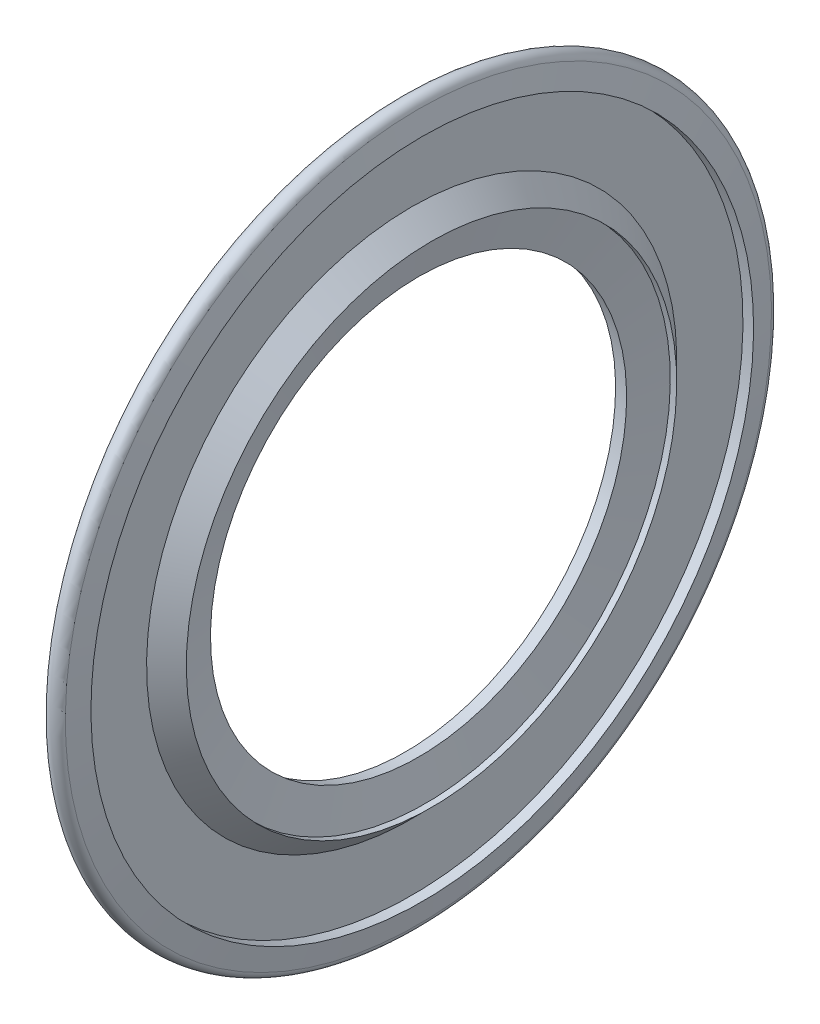
ISO-10303-21;
HEADER;
FILE_DESCRIPTION(('STEP AP214'),'2;1');
FILE_NAME('part.step','',(''),(''),'','','');
FILE_SCHEMA(('AUTOMOTIVE_DESIGN { 1 0 10303 214 1 1 1 1 }'));
ENDSEC;
DATA;
#1=APPLICATION_CONTEXT('core data for automotive mechanical design processes');
#2=APPLICATION_PROTOCOL_DEFINITION('international standard','automotive_design',2000,#1);
#3=PRODUCT_CONTEXT('',#1,'mechanical');
#4=PRODUCT('Part','Part','',(#3));
#5=PRODUCT_RELATED_PRODUCT_CATEGORY('part','',(#4));
#6=PRODUCT_DEFINITION_FORMATION('','',#4);
#7=PRODUCT_DEFINITION_CONTEXT('part definition',#1,'design');
#8=PRODUCT_DEFINITION('design','',#6,#7);
#9=PRODUCT_DEFINITION_SHAPE('','',#8);
#10=(LENGTH_UNIT() NAMED_UNIT(*) SI_UNIT(.MILLI.,.METRE.));
#11=(NAMED_UNIT(*) PLANE_ANGLE_UNIT() SI_UNIT($,.RADIAN.));
#12=(NAMED_UNIT(*) SI_UNIT($,.STERADIAN.) SOLID_ANGLE_UNIT());
#13=UNCERTAINTY_MEASURE_WITH_UNIT(LENGTH_MEASURE(1.E-05),#10,'distance_accuracy_value','');
#14=(GEOMETRIC_REPRESENTATION_CONTEXT(3) GLOBAL_UNCERTAINTY_ASSIGNED_CONTEXT((#13)) GLOBAL_UNIT_ASSIGNED_CONTEXT((#10,
#11,#12)) REPRESENTATION_CONTEXT('',''));
#15=CARTESIAN_POINT('',(0.,0.,0.));
#16=DIRECTION('',(0.,0.,1.));
#17=DIRECTION('',(1.,0.,0.));
#18=AXIS2_PLACEMENT_3D('',#15,#16,#17);
#19=CARTESIAN_POINT('',(0.5244,0.,0.));
#20=DIRECTION('',(-1.,0.,0.));
#21=DIRECTION('',(0.,1.,0.));
#22=AXIS2_PLACEMENT_3D('',#19,#20,#21);
#23=CONICAL_SURFACE('',#22,7.36375359064417,0.174532925199433);
#24=CARTESIAN_POINT('',(0.76,0.,0.));
#25=DIRECTION('',(1.,0.,0.));
#26=DIRECTION('',(0.,1.,0.));
#27=AXIS2_PLACEMENT_3D('',#24,#25,#26);
#28=CIRCLE('',#27,7.32221095398925);
#29=CARTESIAN_POINT('',(0.76,7.32221095398925,0.));
#30=VERTEX_POINT('',#29);
#31=EDGE_CURVE('E11',#30,#30,#28,.T.);
#32=ORIENTED_EDGE('',*,*,#31,.T.);
#33=EDGE_LOOP('',(#32));
#34=FACE_BOUND('',#33,.T.);
#35=CARTESIAN_POINT('',(0.2888,0.,0.));
#36=DIRECTION('',(1.,0.,0.));
#37=DIRECTION('',(0.,1.,0.));
#38=AXIS2_PLACEMENT_3D('',#35,#36,#37);
#39=CIRCLE('',#38,7.40529622729908);
#40=CARTESIAN_POINT('',(0.2888,7.40529622729908,0.));
#41=VERTEX_POINT('',#40);
#42=EDGE_CURVE('E67',#41,#41,#39,.T.);
#43=ORIENTED_EDGE('',*,*,#42,.F.);
#44=EDGE_LOOP('',(#43));
#45=FACE_BOUND('',#44,.T.);
#46=ADVANCED_FACE('F17',(#34,#45),#23,.F.);
#47=CARTESIAN_POINT('',(0.875189042580397,0.,0.));
#48=DIRECTION('',(1.,0.,0.));
#49=DIRECTION('',(0.,1.,0.));
#50=AXIS2_PLACEMENT_3D('',#47,#48,#49);
#51=CONICAL_SURFACE('',#50,7.97548047699463,1.39626340159546);
#52=CARTESIAN_POINT('',(0.990378085160793,0.,0.));
#53=DIRECTION('',(1.,0.,0.));
#54=DIRECTION('',(0.,1.,0.));
#55=AXIS2_PLACEMENT_3D('',#52,#53,#54);
#56=CIRCLE('',#55,8.62875);
#57=CARTESIAN_POINT('',(0.990378085160793,8.62875,0.));
#58=VERTEX_POINT('',#57);
#59=EDGE_CURVE('E27',#58,#58,#56,.T.);
#60=ORIENTED_EDGE('',*,*,#59,.T.);
#61=EDGE_LOOP('',(#60));
#62=FACE_BOUND('',#61,.T.);
#63=ORIENTED_EDGE('',*,*,#31,.F.);
#64=EDGE_LOOP('',(#63));
#65=FACE_BOUND('',#64,.T.);
#66=ADVANCED_FACE('F131',(#62,#65),#51,.F.);
#67=CARTESIAN_POINT('',(1.1031890425804,0.,0.));
#68=DIRECTION('',(-1.,0.,0.));
#69=DIRECTION('',(0.,1.,0.));
#70=AXIS2_PLACEMENT_3D('',#67,#68,#69);
#71=CYLINDRICAL_SURFACE('',#70,8.62875);
#72=CARTESIAN_POINT('',(1.216,0.,0.));
#73=DIRECTION('',(1.,0.,0.));
#74=DIRECTION('',(0.,1.,0.));
#75=AXIS2_PLACEMENT_3D('',#72,#73,#74);
#76=CIRCLE('',#75,8.62875);
#77=CARTESIAN_POINT('',(1.216,8.62875,0.));
#78=VERTEX_POINT('',#77);
#79=EDGE_CURVE('E97',#78,#78,#76,.T.);
#80=ORIENTED_EDGE('',*,*,#79,.T.);
#81=EDGE_LOOP('',(#80));
#82=FACE_BOUND('',#81,.T.);
#83=ORIENTED_EDGE('',*,*,#59,.F.);
#84=EDGE_LOOP('',(#83));
#85=FACE_BOUND('',#84,.T.);
#86=ADVANCED_FACE('F136',(#82,#85),#71,.F.);
#87=CARTESIAN_POINT('',(0.8664,0.,0.));
#88=DIRECTION('',(-1.,0.,0.));
#89=DIRECTION('',(0.,1.,0.));
#90=AXIS2_PLACEMENT_3D('',#87,#88,#89);
#91=CONICAL_SURFACE('',#90,8.97835,0.785398163397448);
#92=CARTESIAN_POINT('',(0.5168,0.,0.));
#93=DIRECTION('',(1.,0.,0.));
#94=DIRECTION('',(0.,1.,0.));
#95=AXIS2_PLACEMENT_3D('',#92,#93,#94);
#96=CIRCLE('',#95,9.32795);
#97=CARTESIAN_POINT('',(0.5168,9.32795,0.));
#98=VERTEX_POINT('',#97);
#99=EDGE_CURVE('E21',#98,#98,#96,.T.);
#100=ORIENTED_EDGE('',*,*,#99,.T.);
#101=EDGE_LOOP('',(#100));
#102=FACE_BOUND('',#101,.T.);
#103=ORIENTED_EDGE('',*,*,#79,.F.);
#104=EDGE_LOOP('',(#103));
#105=FACE_BOUND('',#104,.T.);
#106=ADVANCED_FACE('F143',(#102,#105),#91,.T.);
#107=CARTESIAN_POINT('',(0.5168,10.4936875,0.));
#108=DIRECTION('',(1.,0.,0.));
#109=DIRECTION('',(0.,1.,0.));
#110=AXIS2_PLACEMENT_3D('',#107,#108,#109);
#111=PLANE('',#110);
#112=CARTESIAN_POINT('',(0.5168,0.,0.));
#113=DIRECTION('',(1.,0.,0.));
#114=DIRECTION('',(0.,1.,0.));
#115=AXIS2_PLACEMENT_3D('',#112,#113,#114);
#116=CIRCLE('',#115,11.659425);
#117=CARTESIAN_POINT('',(0.5168,11.659425,0.));
#118=VERTEX_POINT('',#117);
#119=EDGE_CURVE('E100',#118,#118,#116,.T.);
#120=ORIENTED_EDGE('',*,*,#119,.T.);
#121=EDGE_LOOP('',(#120));
#122=FACE_BOUND('',#121,.T.);
#123=ORIENTED_EDGE('',*,*,#99,.F.);
#124=EDGE_LOOP('',(#123));
#125=FACE_BOUND('',#124,.T.);
#126=ADVANCED_FACE('F126',(#122,#125),#111,.T.);
#127=CARTESIAN_POINT('',(0.703599683002328,0.,0.));
#128=DIRECTION('',(-1.,0.,0.));
#129=DIRECTION('',(0.,1.,0.));
#130=AXIS2_PLACEMENT_3D('',#127,#128,#129);
#131=CYLINDRICAL_SURFACE('',#130,11.659425);
#132=CARTESIAN_POINT('',(0.890399366004656,0.,0.));
#133=DIRECTION('',(1.,0.,0.));
#134=DIRECTION('',(0.,1.,0.));
#135=AXIS2_PLACEMENT_3D('',#132,#133,#134);
#136=CIRCLE('',#135,11.659425);
#137=CARTESIAN_POINT('',(0.890399366004656,11.659425,0.));
#138=VERTEX_POINT('',#137);
#139=EDGE_CURVE('E87',#138,#138,#136,.T.);
#140=ORIENTED_EDGE('',*,*,#139,.T.);
#141=EDGE_LOOP('',(#140));
#142=FACE_BOUND('',#141,.T.);
#143=ORIENTED_EDGE('',*,*,#119,.F.);
#144=EDGE_LOOP('',(#143));
#145=FACE_BOUND('',#144,.T.);
#146=ADVANCED_FACE('F113',(#142,#145),#131,.F.);
#147=CARTESIAN_POINT('',(0.822890461460184,0.,0.));
#148=DIRECTION('',(-1.,0.,0.));
#149=DIRECTION('',(0.,1.,0.));
#150=AXIS2_PLACEMENT_3D('',#147,#148,#149);
#151=CONICAL_SURFACE('',#150,12.0422870230054,1.39626340159546);
#152=CARTESIAN_POINT('',(0.755381556915711,0.,0.));
#153=DIRECTION('',(1.,0.,0.));
#154=DIRECTION('',(0.,1.,0.));
#155=AXIS2_PLACEMENT_3D('',#152,#153,#154);
#156=CIRCLE('',#155,12.4251490460107);
#157=CARTESIAN_POINT('',(0.755381556915711,12.4251490460107,0.));
#158=VERTEX_POINT('',#157);
#159=EDGE_CURVE('E81',#158,#158,#156,.T.);
#160=ORIENTED_EDGE('',*,*,#159,.T.);
#161=EDGE_LOOP('',(#160));
#162=FACE_BOUND('',#161,.T.);
#163=ORIENTED_EDGE('',*,*,#139,.F.);
#164=EDGE_LOOP('',(#163));
#165=FACE_BOUND('',#164,.T.);
#166=ADVANCED_FACE('F116',(#162,#165),#151,.T.);
#167=CARTESIAN_POINT('',(0.456,0.,0.));
#168=DIRECTION('',(1.,0.,0.));
#169=DIRECTION('',(0.,0.,-1.));
#170=AXIS2_PLACEMENT_3D('',#167,#168,#169);
#171=TOROIDAL_SURFACE('',#170,12.37236,0.304);
#172=CARTESIAN_POINT('',(0.19272827724953,0.,0.));
#173=DIRECTION('',(1.,0.,0.));
#174=DIRECTION('',(0.,1.,0.));
#175=AXIS2_PLACEMENT_3D('',#172,#173,#174);
#176=CIRCLE('',#175,12.52436);
#177=CARTESIAN_POINT('',(0.19272827724953,12.52436,0.));
#178=VERTEX_POINT('',#177);
#179=EDGE_CURVE('E76',#178,#178,#176,.T.);
#180=ORIENTED_EDGE('',*,*,#179,.T.);
#181=EDGE_LOOP('',(#180));
#182=FACE_BOUND('',#181,.T.);
#183=ORIENTED_EDGE('',*,*,#159,.F.);
#184=EDGE_LOOP('',(#183));
#185=FACE_BOUND('',#184,.T.);
#186=ADVANCED_FACE('F77',(#182,#185),#171,.T.);
#187=CARTESIAN_POINT('',(0.19272827724953,12.28116,0.));
#188=DIRECTION('',(-1.,0.,0.));
#189=DIRECTION('',(0.,-1.,0.));
#190=AXIS2_PLACEMENT_3D('',#187,#188,#189);
#191=PLANE('',#190);
#192=CARTESIAN_POINT('',(0.19272827724953,0.,0.));
#193=DIRECTION('',(1.,0.,0.));
#194=DIRECTION('',(0.,1.,0.));
#195=AXIS2_PLACEMENT_3D('',#192,#193,#194);
#196=CIRCLE('',#195,12.03796);
#197=CARTESIAN_POINT('',(0.19272827724953,12.03796,0.));
#198=VERTEX_POINT('',#197);
#199=EDGE_CURVE('E82',#198,#198,#196,.T.);
#200=ORIENTED_EDGE('',*,*,#199,.T.);
#201=EDGE_LOOP('',(#200));
#202=FACE_BOUND('',#201,.T.);
#203=ORIENTED_EDGE('',*,*,#179,.F.);
#204=EDGE_LOOP('',(#203));
#205=FACE_BOUND('',#204,.T.);
#206=ADVANCED_FACE('F19',(#202,#205),#191,.T.);
#207=CARTESIAN_POINT('',(0.126764138624766,0.,0.));
#208=DIRECTION('',(1.,0.,0.));
#209=DIRECTION('',(0.,1.,0.));
#210=AXIS2_PLACEMENT_3D('',#207,#208,#209);
#211=CONICAL_SURFACE('',#210,11.9719958613752,0.785398163397442);
#212=CARTESIAN_POINT('',(0.0608,0.,0.));
#213=DIRECTION('',(1.,0.,0.));
#214=DIRECTION('',(0.,1.,0.));
#215=AXIS2_PLACEMENT_3D('',#212,#213,#214);
#216=CIRCLE('',#215,11.9060317227505);
#217=CARTESIAN_POINT('',(0.0608,11.9060317227505,0.));
#218=VERTEX_POINT('',#217);
#219=EDGE_CURVE('E89',#218,#218,#216,.T.);
#220=ORIENTED_EDGE('',*,*,#219,.T.);
#221=EDGE_LOOP('',(#220));
#222=FACE_BOUND('',#221,.T.);
#223=ORIENTED_EDGE('',*,*,#199,.F.);
#224=EDGE_LOOP('',(#223));
#225=FACE_BOUND('',#224,.T.);
#226=ADVANCED_FACE('F141',(#222,#225),#211,.T.);
#227=CARTESIAN_POINT('',(0.0608,10.2673908613752,0.));
#228=DIRECTION('',(-1.,0.,0.));
#229=DIRECTION('',(0.,-1.,0.));
#230=AXIS2_PLACEMENT_3D('',#227,#228,#229);
#231=PLANE('',#230);
#232=CARTESIAN_POINT('',(0.0608,0.,0.));
#233=DIRECTION('',(1.,0.,0.));
#234=DIRECTION('',(0.,1.,0.));
#235=AXIS2_PLACEMENT_3D('',#232,#233,#234);
#236=CIRCLE('',#235,8.62875);
#237=CARTESIAN_POINT('',(0.0608,8.62875,0.));
#238=VERTEX_POINT('',#237);
#239=EDGE_CURVE('E94',#238,#238,#236,.T.);
#240=ORIENTED_EDGE('',*,*,#239,.T.);
#241=EDGE_LOOP('',(#240));
#242=FACE_BOUND('',#241,.T.);
#243=ORIENTED_EDGE('',*,*,#219,.F.);
#244=EDGE_LOOP('',(#243));
#245=FACE_BOUND('',#244,.T.);
#246=ADVANCED_FACE('F152',(#242,#245),#231,.T.);
#247=CARTESIAN_POINT('',(0.1748,0.,0.));
#248=DIRECTION('',(-1.,0.,0.));
#249=DIRECTION('',(0.,1.,0.));
#250=AXIS2_PLACEMENT_3D('',#247,#248,#249);
#251=CYLINDRICAL_SURFACE('',#250,8.62875);
#252=CARTESIAN_POINT('',(0.2888,0.,0.));
#253=DIRECTION('',(1.,0.,0.));
#254=DIRECTION('',(0.,1.,0.));
#255=AXIS2_PLACEMENT_3D('',#252,#253,#254);
#256=CIRCLE('',#255,8.62875);
#257=CARTESIAN_POINT('',(0.2888,8.62875,0.));
#258=VERTEX_POINT('',#257);
#259=EDGE_CURVE('E63',#258,#258,#256,.T.);
#260=ORIENTED_EDGE('',*,*,#259,.T.);
#261=EDGE_LOOP('',(#260));
#262=FACE_BOUND('',#261,.T.);
#263=ORIENTED_EDGE('',*,*,#239,.F.);
#264=EDGE_LOOP('',(#263));
#265=FACE_BOUND('',#264,.T.);
#266=ADVANCED_FACE('F149',(#262,#265),#251,.F.);
#267=CARTESIAN_POINT('',(0.2888,8.01702311364954,0.));
#268=DIRECTION('',(-1.,0.,0.));
#269=DIRECTION('',(0.,-1.,0.));
#270=AXIS2_PLACEMENT_3D('',#267,#268,#269);
#271=PLANE('',#270);
#272=ORIENTED_EDGE('',*,*,#42,.T.);
#273=EDGE_LOOP('',(#272));
#274=FACE_BOUND('',#273,.T.);
#275=ORIENTED_EDGE('',*,*,#259,.F.);
#276=EDGE_LOOP('',(#275));
#277=FACE_BOUND('',#276,.T.);
#278=ADVANCED_FACE('F146',(#274,#277),#271,.T.);
#279=CLOSED_SHELL('',(#46,#66,#86,#106,#126,#146,#166,#186,#206,#226,#246,#266,#278));
#280=MANIFOLD_SOLID_BREP('B1',#279);
#281=ADVANCED_BREP_SHAPE_REPRESENTATION('',(#18,#280),#14);
#282=SHAPE_DEFINITION_REPRESENTATION(#9,#281);
ENDSEC;
END-ISO-10303-21;
